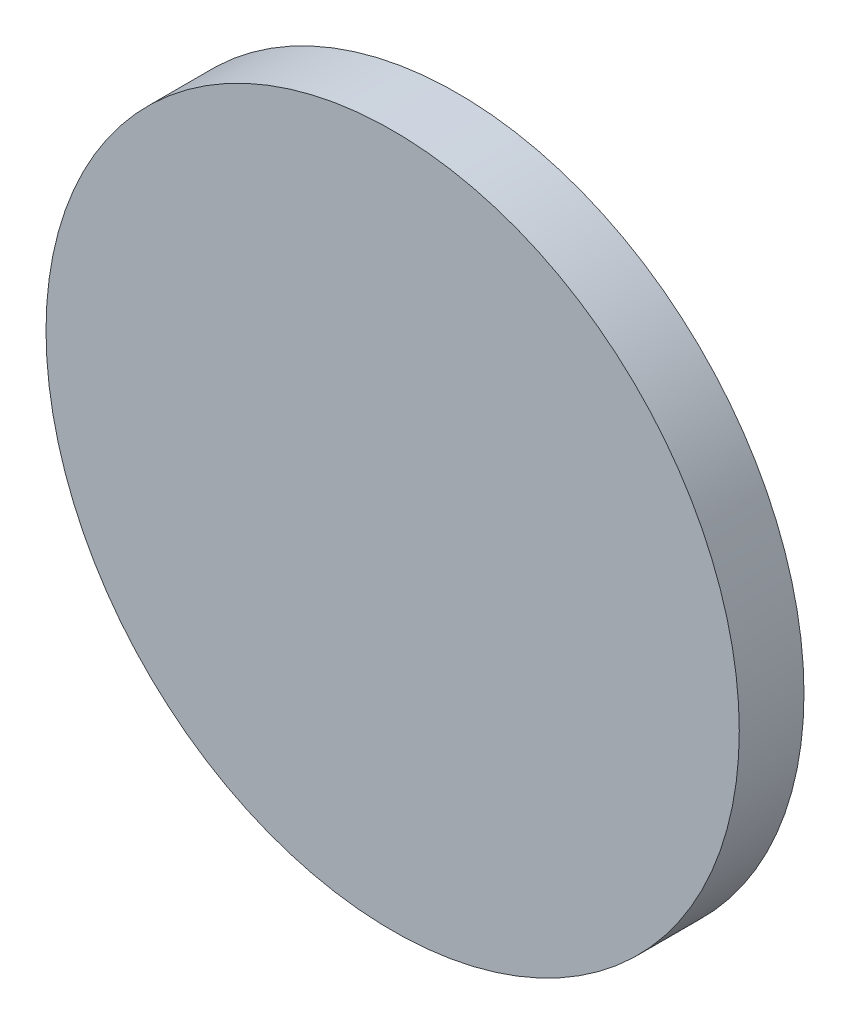
ISO-10303-21;
HEADER;
FILE_DESCRIPTION(('STEP AP214'),'2;1');
FILE_NAME('part.step','',(''),(''),'','','');
FILE_SCHEMA(('AUTOMOTIVE_DESIGN { 1 0 10303 214 1 1 1 1 }'));
ENDSEC;
DATA;
#1=APPLICATION_CONTEXT('core data for automotive mechanical design processes');
#2=APPLICATION_PROTOCOL_DEFINITION('international standard','automotive_design',2000,#1);
#3=PRODUCT_CONTEXT('',#1,'mechanical');
#4=PRODUCT('Part','Part','',(#3));
#5=PRODUCT_RELATED_PRODUCT_CATEGORY('part','',(#4));
#6=PRODUCT_DEFINITION_FORMATION('','',#4);
#7=PRODUCT_DEFINITION_CONTEXT('part definition',#1,'design');
#8=PRODUCT_DEFINITION('design','',#6,#7);
#9=PRODUCT_DEFINITION_SHAPE('','',#8);
#10=(LENGTH_UNIT() NAMED_UNIT(*) SI_UNIT(.MILLI.,.METRE.));
#11=(NAMED_UNIT(*) PLANE_ANGLE_UNIT() SI_UNIT($,.RADIAN.));
#12=(NAMED_UNIT(*) SI_UNIT($,.STERADIAN.) SOLID_ANGLE_UNIT());
#13=UNCERTAINTY_MEASURE_WITH_UNIT(LENGTH_MEASURE(1.E-05),#10,'distance_accuracy_value','');
#14=(GEOMETRIC_REPRESENTATION_CONTEXT(3) GLOBAL_UNCERTAINTY_ASSIGNED_CONTEXT((#13)) GLOBAL_UNIT_ASSIGNED_CONTEXT((#10,
#11,#12)) REPRESENTATION_CONTEXT('',''));
#15=CARTESIAN_POINT('',(0.,0.,0.));
#16=DIRECTION('',(0.,0.,1.));
#17=DIRECTION('',(1.,0.,0.));
#18=AXIS2_PLACEMENT_3D('',#15,#16,#17);
#19=CARTESIAN_POINT('',(0.,0.,7.));
#20=DIRECTION('',(0.,0.,-1.));
#21=DIRECTION('',(-1.,0.,0.));
#22=AXIS2_PLACEMENT_3D('',#19,#20,#21);
#23=CYLINDRICAL_SURFACE('',#22,37.5);
#24=CARTESIAN_POINT('',(0.,0.,7.));
#25=DIRECTION('',(0.,0.,1.));
#26=DIRECTION('',(1.,0.,0.));
#27=AXIS2_PLACEMENT_3D('',#24,#25,#26);
#28=CIRCLE('',#27,37.5);
#29=CARTESIAN_POINT('',(37.5,0.,7.));
#30=VERTEX_POINT('',#29);
#31=EDGE_CURVE('E10',#30,#30,#28,.T.);
#32=ORIENTED_EDGE('',*,*,#31,.F.);
#33=EDGE_LOOP('',(#32));
#34=FACE_BOUND('',#33,.T.);
#35=CARTESIAN_POINT('',(0.,0.,0.));
#36=DIRECTION('',(0.,0.,1.));
#37=DIRECTION('',(1.,0.,0.));
#38=AXIS2_PLACEMENT_3D('',#35,#36,#37);
#39=CIRCLE('',#38,37.5);
#40=CARTESIAN_POINT('',(37.5,0.,0.));
#41=VERTEX_POINT('',#40);
#42=EDGE_CURVE('E37',#41,#41,#39,.T.);
#43=ORIENTED_EDGE('',*,*,#42,.T.);
#44=EDGE_LOOP('',(#43));
#45=FACE_BOUND('',#44,.T.);
#46=ADVANCED_FACE('F34',(#34,#45),#23,.T.);
#47=CARTESIAN_POINT('',(0.,0.,7.));
#48=DIRECTION('',(0.,0.,1.));
#49=DIRECTION('',(1.,0.,0.));
#50=AXIS2_PLACEMENT_3D('',#47,#48,#49);
#51=PLANE('',#50);
#52=ORIENTED_EDGE('',*,*,#31,.T.);
#53=EDGE_LOOP('',(#52));
#54=FACE_BOUND('',#53,.T.);
#55=ADVANCED_FACE('F49',(#54),#51,.T.);
#56=CARTESIAN_POINT('',(0.,0.,0.));
#57=DIRECTION('',(0.,0.,1.));
#58=DIRECTION('',(1.,0.,0.));
#59=AXIS2_PLACEMENT_3D('',#56,#57,#58);
#60=PLANE('',#59);
#61=ORIENTED_EDGE('',*,*,#42,.F.);
#62=EDGE_LOOP('',(#61));
#63=FACE_BOUND('',#62,.T.);
#64=ADVANCED_FACE('F47',(#63),#60,.F.);
#65=CLOSED_SHELL('',(#46,#55,#64));
#66=MANIFOLD_SOLID_BREP('B2',#65);
#67=ADVANCED_BREP_SHAPE_REPRESENTATION('',(#18,#66),#14);
#68=SHAPE_DEFINITION_REPRESENTATION(#9,#67);
ENDSEC;
END-ISO-10303-21;
